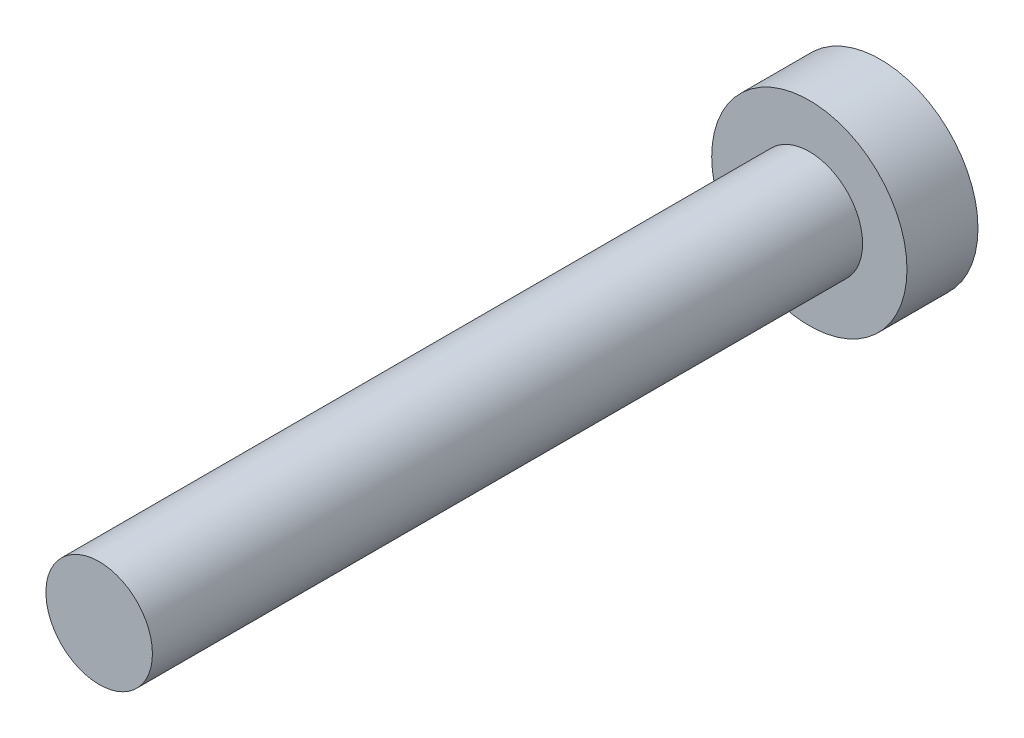
ISO-10303-21;
HEADER;
FILE_DESCRIPTION(('STEP AP214'),'2;1');
FILE_NAME('part.step','',(''),(''),'','','');
FILE_SCHEMA(('AUTOMOTIVE_DESIGN { 1 0 10303 214 1 1 1 1 }'));
ENDSEC;
DATA;
#1=APPLICATION_CONTEXT('core data for automotive mechanical design processes');
#2=APPLICATION_PROTOCOL_DEFINITION('international standard','automotive_design',2000,#1);
#3=PRODUCT_CONTEXT('',#1,'mechanical');
#4=PRODUCT('Part','Part','',(#3));
#5=PRODUCT_RELATED_PRODUCT_CATEGORY('part','',(#4));
#6=PRODUCT_DEFINITION_FORMATION('','',#4);
#7=PRODUCT_DEFINITION_CONTEXT('part definition',#1,'design');
#8=PRODUCT_DEFINITION('design','',#6,#7);
#9=PRODUCT_DEFINITION_SHAPE('','',#8);
#10=(LENGTH_UNIT() NAMED_UNIT(*) SI_UNIT(.MILLI.,.METRE.));
#11=(NAMED_UNIT(*) PLANE_ANGLE_UNIT() SI_UNIT($,.RADIAN.));
#12=(NAMED_UNIT(*) SI_UNIT($,.STERADIAN.) SOLID_ANGLE_UNIT());
#13=UNCERTAINTY_MEASURE_WITH_UNIT(LENGTH_MEASURE(1.E-05),#10,'distance_accuracy_value','');
#14=(GEOMETRIC_REPRESENTATION_CONTEXT(3) GLOBAL_UNCERTAINTY_ASSIGNED_CONTEXT((#13)) GLOBAL_UNIT_ASSIGNED_CONTEXT((#10,
#11,#12)) REPRESENTATION_CONTEXT('',''));
#15=CARTESIAN_POINT('',(0.,0.,0.));
#16=DIRECTION('',(0.,0.,1.));
#17=DIRECTION('',(1.,0.,0.));
#18=AXIS2_PLACEMENT_3D('',#15,#16,#17);
#19=CARTESIAN_POINT('',(0.,0.,2.));
#20=DIRECTION('',(0.,0.,1.));
#21=DIRECTION('',(1.,0.,0.));
#22=AXIS2_PLACEMENT_3D('',#19,#20,#21);
#23=PLANE('',#22);
#24=CARTESIAN_POINT('',(0.,0.,2.));
#25=DIRECTION('',(0.,0.,1.));
#26=DIRECTION('',(1.,0.,0.));
#27=AXIS2_PLACEMENT_3D('',#24,#25,#26);
#28=CIRCLE('',#27,2.75);
#29=CARTESIAN_POINT('',(2.75,0.,2.));
#30=VERTEX_POINT('',#29);
#31=EDGE_CURVE('E10',#30,#30,#28,.T.);
#32=ORIENTED_EDGE('',*,*,#31,.T.);
#33=EDGE_LOOP('',(#32));
#34=FACE_BOUND('',#33,.T.);
#35=CARTESIAN_POINT('',(0.,0.,2.));
#36=DIRECTION('',(0.,0.,1.));
#37=DIRECTION('',(1.,0.,0.));
#38=AXIS2_PLACEMENT_3D('',#35,#36,#37);
#39=CIRCLE('',#38,1.5);
#40=CARTESIAN_POINT('',(1.5,0.,2.));
#41=VERTEX_POINT('',#40);
#42=EDGE_CURVE('E44',#41,#41,#39,.T.);
#43=ORIENTED_EDGE('',*,*,#42,.F.);
#44=EDGE_LOOP('',(#43));
#45=FACE_BOUND('',#44,.T.);
#46=ADVANCED_FACE('F31',(#34,#45),#23,.T.);
#47=CARTESIAN_POINT('',(0.,0.,2.));
#48=DIRECTION('',(0.,0.,-1.));
#49=DIRECTION('',(-1.,0.,0.));
#50=AXIS2_PLACEMENT_3D('',#47,#48,#49);
#51=CYLINDRICAL_SURFACE('',#50,2.75);
#52=ORIENTED_EDGE('',*,*,#31,.F.);
#53=EDGE_LOOP('',(#52));
#54=FACE_BOUND('',#53,.T.);
#55=CARTESIAN_POINT('',(0.,0.,0.));
#56=DIRECTION('',(0.,0.,1.));
#57=DIRECTION('',(1.,0.,0.));
#58=AXIS2_PLACEMENT_3D('',#55,#56,#57);
#59=CIRCLE('',#58,2.75);
#60=CARTESIAN_POINT('',(2.75,0.,0.));
#61=VERTEX_POINT('',#60);
#62=EDGE_CURVE('E35',#61,#61,#59,.T.);
#63=ORIENTED_EDGE('',*,*,#62,.T.);
#64=EDGE_LOOP('',(#63));
#65=FACE_BOUND('',#64,.T.);
#66=ADVANCED_FACE('F33',(#54,#65),#51,.T.);
#67=CARTESIAN_POINT('',(0.,0.,0.));
#68=DIRECTION('',(0.,0.,1.));
#69=DIRECTION('',(1.,0.,0.));
#70=AXIS2_PLACEMENT_3D('',#67,#68,#69);
#71=PLANE('',#70);
#72=ORIENTED_EDGE('',*,*,#62,.F.);
#73=EDGE_LOOP('',(#72));
#74=FACE_BOUND('',#73,.T.);
#75=ADVANCED_FACE('F55',(#74),#71,.F.);
#76=CARTESIAN_POINT('',(0.,0.,22.));
#77=DIRECTION('',(0.,0.,-1.));
#78=DIRECTION('',(-1.,0.,0.));
#79=AXIS2_PLACEMENT_3D('',#76,#77,#78);
#80=CYLINDRICAL_SURFACE('',#79,1.5);
#81=CARTESIAN_POINT('',(0.,0.,22.));
#82=DIRECTION('',(0.,0.,1.));
#83=DIRECTION('',(1.,0.,0.));
#84=AXIS2_PLACEMENT_3D('',#81,#82,#83);
#85=CIRCLE('',#84,1.5);
#86=CARTESIAN_POINT('',(1.5,0.,22.));
#87=VERTEX_POINT('',#86);
#88=EDGE_CURVE('E42',#87,#87,#85,.T.);
#89=ORIENTED_EDGE('',*,*,#88,.F.);
#90=EDGE_LOOP('',(#89));
#91=FACE_BOUND('',#90,.T.);
#92=ORIENTED_EDGE('',*,*,#42,.T.);
#93=EDGE_LOOP('',(#92));
#94=FACE_BOUND('',#93,.T.);
#95=ADVANCED_FACE('F52',(#91,#94),#80,.T.);
#96=CARTESIAN_POINT('',(0.,0.,22.));
#97=DIRECTION('',(0.,0.,1.));
#98=DIRECTION('',(1.,0.,0.));
#99=AXIS2_PLACEMENT_3D('',#96,#97,#98);
#100=PLANE('',#99);
#101=ORIENTED_EDGE('',*,*,#88,.T.);
#102=EDGE_LOOP('',(#101));
#103=FACE_BOUND('',#102,.T.);
#104=ADVANCED_FACE('F50',(#103),#100,.T.);
#105=CLOSED_SHELL('',(#46,#66,#75,#95,#104));
#106=MANIFOLD_SOLID_BREP('B2',#105);
#107=ADVANCED_BREP_SHAPE_REPRESENTATION('',(#18,#106),#14);
#108=SHAPE_DEFINITION_REPRESENTATION(#9,#107);
ENDSEC;
END-ISO-10303-21;
